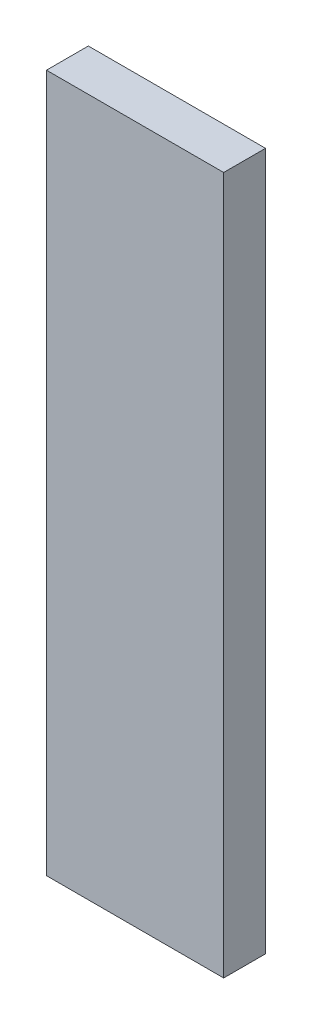
ISO-10303-21;
HEADER;
FILE_DESCRIPTION(('STEP AP214'),'2;1');
FILE_NAME('part.step','',(''),(''),'','','');
FILE_SCHEMA(('AUTOMOTIVE_DESIGN { 1 0 10303 214 1 1 1 1 }'));
ENDSEC;
DATA;
#1=APPLICATION_CONTEXT('core data for automotive mechanical design processes');
#2=APPLICATION_PROTOCOL_DEFINITION('international standard','automotive_design',2000,#1);
#3=PRODUCT_CONTEXT('',#1,'mechanical');
#4=PRODUCT('Part','Part','',(#3));
#5=PRODUCT_RELATED_PRODUCT_CATEGORY('part','',(#4));
#6=PRODUCT_DEFINITION_FORMATION('','',#4);
#7=PRODUCT_DEFINITION_CONTEXT('part definition',#1,'design');
#8=PRODUCT_DEFINITION('design','',#6,#7);
#9=PRODUCT_DEFINITION_SHAPE('','',#8);
#10=(LENGTH_UNIT() NAMED_UNIT(*) SI_UNIT(.MILLI.,.METRE.));
#11=(NAMED_UNIT(*) PLANE_ANGLE_UNIT() SI_UNIT($,.RADIAN.));
#12=(NAMED_UNIT(*) SI_UNIT($,.STERADIAN.) SOLID_ANGLE_UNIT());
#13=UNCERTAINTY_MEASURE_WITH_UNIT(LENGTH_MEASURE(1.E-05),#10,'distance_accuracy_value','');
#14=(GEOMETRIC_REPRESENTATION_CONTEXT(3) GLOBAL_UNCERTAINTY_ASSIGNED_CONTEXT((#13)) GLOBAL_UNIT_ASSIGNED_CONTEXT((#10,
#11,#12)) REPRESENTATION_CONTEXT('',''));
#15=CARTESIAN_POINT('',(0.,0.,0.));
#16=DIRECTION('',(0.,0.,1.));
#17=DIRECTION('',(1.,0.,0.));
#18=AXIS2_PLACEMENT_3D('',#15,#16,#17);
#19=CARTESIAN_POINT('',(3.175,-12.5,1.5));
#20=DIRECTION('',(-1.,0.,0.));
#21=DIRECTION('',(0.,0.,1.));
#22=AXIS2_PLACEMENT_3D('',#19,#20,#21);
#23=PLANE('',#22);
#24=DIRECTION('',(0.,1.,0.));
#25=VECTOR('',#24,1.);
#26=CARTESIAN_POINT('',(3.175,-12.5,0.));
#27=LINE('',#26,#25);
#28=CARTESIAN_POINT('',(3.175,-12.5,0.));
#29=VERTEX_POINT('',#28);
#30=CARTESIAN_POINT('',(3.175,12.5,0.));
#31=VERTEX_POINT('',#30);
#32=EDGE_CURVE('E113',#29,#31,#27,.T.);
#33=ORIENTED_EDGE('',*,*,#32,.T.);
#34=DIRECTION('',(0.,0.,-1.));
#35=VECTOR('',#34,1.);
#36=CARTESIAN_POINT('',(3.175,12.5,1.5));
#37=LINE('',#36,#35);
#38=CARTESIAN_POINT('',(3.175,12.5,1.5));
#39=VERTEX_POINT('',#38);
#40=EDGE_CURVE('E11',#39,#31,#37,.T.);
#41=ORIENTED_EDGE('',*,*,#40,.F.);
#42=DIRECTION('',(0.,1.,0.));
#43=VECTOR('',#42,1.);
#44=CARTESIAN_POINT('',(3.175,-12.5,1.5));
#45=LINE('',#44,#43);
#46=CARTESIAN_POINT('',(3.175,-12.5,1.5));
#47=VERTEX_POINT('',#46);
#48=EDGE_CURVE('E97',#47,#39,#45,.T.);
#49=ORIENTED_EDGE('',*,*,#48,.F.);
#50=DIRECTION('',(0.,0.,-1.));
#51=VECTOR('',#50,1.);
#52=CARTESIAN_POINT('',(3.175,-12.5,1.5));
#53=LINE('',#52,#51);
#54=EDGE_CURVE('E109',#47,#29,#53,.T.);
#55=ORIENTED_EDGE('',*,*,#54,.T.);
#56=EDGE_LOOP('',(#33,#41,#49,#55));
#57=FACE_BOUND('',#56,.T.);
#58=ADVANCED_FACE('F45',(#57),#23,.F.);
#59=CARTESIAN_POINT('',(-3.175,12.5,1.5));
#60=DIRECTION('',(0.,-1.,0.));
#61=DIRECTION('',(0.,0.,-1.));
#62=AXIS2_PLACEMENT_3D('',#59,#60,#61);
#63=PLANE('',#62);
#64=DIRECTION('',(-1.,0.,0.));
#65=VECTOR('',#64,1.);
#66=CARTESIAN_POINT('',(-3.175,12.5,0.));
#67=LINE('',#66,#65);
#68=CARTESIAN_POINT('',(-3.175,12.5,0.));
#69=VERTEX_POINT('',#68);
#70=EDGE_CURVE('E102',#31,#69,#67,.T.);
#71=ORIENTED_EDGE('',*,*,#70,.T.);
#72=DIRECTION('',(0.,0.,-1.));
#73=VECTOR('',#72,1.);
#74=CARTESIAN_POINT('',(-3.175,12.5,1.5));
#75=LINE('',#74,#73);
#76=CARTESIAN_POINT('',(-3.175,12.5,1.5));
#77=VERTEX_POINT('',#76);
#78=EDGE_CURVE('E54',#77,#69,#75,.T.);
#79=ORIENTED_EDGE('',*,*,#78,.F.);
#80=DIRECTION('',(-1.,0.,0.));
#81=VECTOR('',#80,1.);
#82=CARTESIAN_POINT('',(-3.175,12.5,1.5));
#83=LINE('',#82,#81);
#84=EDGE_CURVE('E92',#39,#77,#83,.T.);
#85=ORIENTED_EDGE('',*,*,#84,.F.);
#86=ORIENTED_EDGE('',*,*,#40,.T.);
#87=EDGE_LOOP('',(#71,#79,#85,#86));
#88=FACE_BOUND('',#87,.T.);
#89=ADVANCED_FACE('F101',(#88),#63,.F.);
#90=CARTESIAN_POINT('',(-3.175,-12.5,1.5));
#91=DIRECTION('',(1.,0.,0.));
#92=DIRECTION('',(0.,0.,-1.));
#93=AXIS2_PLACEMENT_3D('',#90,#91,#92);
#94=PLANE('',#93);
#95=DIRECTION('',(0.,-1.,0.));
#96=VECTOR('',#95,1.);
#97=CARTESIAN_POINT('',(-3.175,-12.5,0.));
#98=LINE('',#97,#96);
#99=CARTESIAN_POINT('',(-3.175,-12.5,0.));
#100=VERTEX_POINT('',#99);
#101=EDGE_CURVE('E79',#69,#100,#98,.T.);
#102=ORIENTED_EDGE('',*,*,#101,.T.);
#103=DIRECTION('',(0.,0.,-1.));
#104=VECTOR('',#103,1.);
#105=CARTESIAN_POINT('',(-3.175,-12.5,1.5));
#106=LINE('',#105,#104);
#107=CARTESIAN_POINT('',(-3.175,-12.5,1.5));
#108=VERTEX_POINT('',#107);
#109=EDGE_CURVE('E104',#108,#100,#106,.T.);
#110=ORIENTED_EDGE('',*,*,#109,.F.);
#111=DIRECTION('',(0.,-1.,0.));
#112=VECTOR('',#111,1.);
#113=CARTESIAN_POINT('',(-3.175,-12.5,1.5));
#114=LINE('',#113,#112);
#115=EDGE_CURVE('E95',#77,#108,#114,.T.);
#116=ORIENTED_EDGE('',*,*,#115,.F.);
#117=ORIENTED_EDGE('',*,*,#78,.T.);
#118=EDGE_LOOP('',(#102,#110,#116,#117));
#119=FACE_BOUND('',#118,.T.);
#120=ADVANCED_FACE('F105',(#119),#94,.F.);
#121=CARTESIAN_POINT('',(-3.175,-12.5,1.5));
#122=DIRECTION('',(0.,1.,0.));
#123=DIRECTION('',(0.,0.,1.));
#124=AXIS2_PLACEMENT_3D('',#121,#122,#123);
#125=PLANE('',#124);
#126=DIRECTION('',(1.,0.,0.));
#127=VECTOR('',#126,1.);
#128=CARTESIAN_POINT('',(-3.175,-12.5,0.));
#129=LINE('',#128,#127);
#130=EDGE_CURVE('E85',#100,#29,#129,.T.);
#131=ORIENTED_EDGE('',*,*,#130,.T.);
#132=ORIENTED_EDGE('',*,*,#54,.F.);
#133=DIRECTION('',(1.,0.,0.));
#134=VECTOR('',#133,1.);
#135=CARTESIAN_POINT('',(-3.175,-12.5,1.5));
#136=LINE('',#135,#134);
#137=EDGE_CURVE('E62',#108,#47,#136,.T.);
#138=ORIENTED_EDGE('',*,*,#137,.F.);
#139=ORIENTED_EDGE('',*,*,#109,.T.);
#140=EDGE_LOOP('',(#131,#132,#138,#139));
#141=FACE_BOUND('',#140,.T.);
#142=ADVANCED_FACE('F126',(#141),#125,.F.);
#143=CARTESIAN_POINT('',(0.,0.,1.5));
#144=DIRECTION('',(0.,0.,-1.));
#145=DIRECTION('',(-1.,0.,0.));
#146=AXIS2_PLACEMENT_3D('',#143,#144,#145);
#147=PLANE('',#146);
#148=ORIENTED_EDGE('',*,*,#48,.T.);
#149=ORIENTED_EDGE('',*,*,#84,.T.);
#150=ORIENTED_EDGE('',*,*,#115,.T.);
#151=ORIENTED_EDGE('',*,*,#137,.T.);
#152=EDGE_LOOP('',(#148,#149,#150,#151));
#153=FACE_BOUND('',#152,.T.);
#154=ADVANCED_FACE('F93',(#153),#147,.F.);
#155=CARTESIAN_POINT('',(0.,0.,0.));
#156=DIRECTION('',(0.,0.,-1.));
#157=DIRECTION('',(-1.,0.,0.));
#158=AXIS2_PLACEMENT_3D('',#155,#156,#157);
#159=PLANE('',#158);
#160=ORIENTED_EDGE('',*,*,#32,.F.);
#161=ORIENTED_EDGE('',*,*,#130,.F.);
#162=ORIENTED_EDGE('',*,*,#101,.F.);
#163=ORIENTED_EDGE('',*,*,#70,.F.);
#164=EDGE_LOOP('',(#160,#161,#162,#163));
#165=FACE_BOUND('',#164,.T.);
#166=ADVANCED_FACE('F129',(#165),#159,.T.);
#167=CLOSED_SHELL('',(#58,#89,#120,#142,#154,#166));
#168=MANIFOLD_SOLID_BREP('B2',#167);
#169=ADVANCED_BREP_SHAPE_REPRESENTATION('',(#18,#168),#14);
#170=SHAPE_DEFINITION_REPRESENTATION(#9,#169);
ENDSEC;
END-ISO-10303-21;
